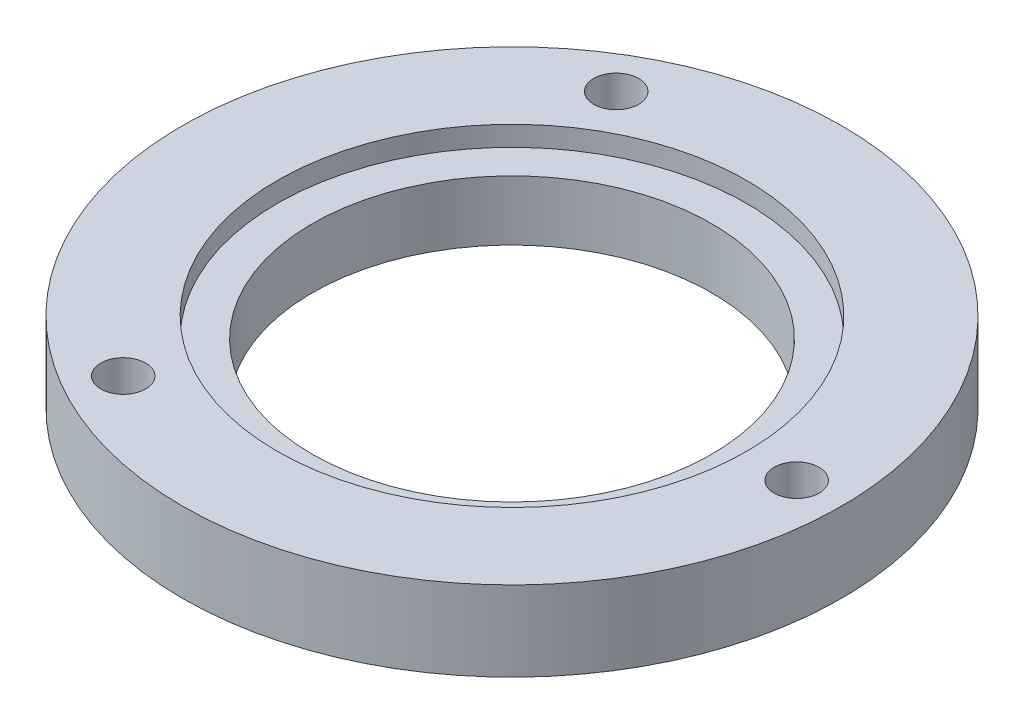
ISO-10303-21;
HEADER;
FILE_DESCRIPTION(('STEP AP214'),'2;1');
FILE_NAME('part.step','',(''),(''),'','','');
FILE_SCHEMA(('AUTOMOTIVE_DESIGN { 1 0 10303 214 1 1 1 1 }'));
ENDSEC;
DATA;
#1=APPLICATION_CONTEXT('core data for automotive mechanical design processes');
#2=APPLICATION_PROTOCOL_DEFINITION('international standard','automotive_design',2000,#1);
#3=PRODUCT_CONTEXT('',#1,'mechanical');
#4=PRODUCT('Part','Part','',(#3));
#5=PRODUCT_RELATED_PRODUCT_CATEGORY('part','',(#4));
#6=PRODUCT_DEFINITION_FORMATION('','',#4);
#7=PRODUCT_DEFINITION_CONTEXT('part definition',#1,'design');
#8=PRODUCT_DEFINITION('design','',#6,#7);
#9=PRODUCT_DEFINITION_SHAPE('','',#8);
#10=(LENGTH_UNIT() NAMED_UNIT(*) SI_UNIT(.MILLI.,.METRE.));
#11=(NAMED_UNIT(*) PLANE_ANGLE_UNIT() SI_UNIT($,.RADIAN.));
#12=(NAMED_UNIT(*) SI_UNIT($,.STERADIAN.) SOLID_ANGLE_UNIT());
#13=UNCERTAINTY_MEASURE_WITH_UNIT(LENGTH_MEASURE(1.E-05),#10,'distance_accuracy_value','');
#14=(GEOMETRIC_REPRESENTATION_CONTEXT(3) GLOBAL_UNCERTAINTY_ASSIGNED_CONTEXT((#13)) GLOBAL_UNIT_ASSIGNED_CONTEXT((#10,
#11,#12)) REPRESENTATION_CONTEXT('',''));
#15=CARTESIAN_POINT('',(0.,0.,0.));
#16=DIRECTION('',(0.,0.,1.));
#17=DIRECTION('',(1.,0.,0.));
#18=AXIS2_PLACEMENT_3D('',#15,#16,#17);
#19=CARTESIAN_POINT('',(23.5,6.,0.));
#20=DIRECTION('',(0.,-1.,0.));
#21=DIRECTION('',(0.,0.,-1.));
#22=AXIS2_PLACEMENT_3D('',#19,#20,#21);
#23=PLANE('',#22);
#24=CARTESIAN_POINT('',(0.,6.,0.));
#25=DIRECTION('',(0.,1.,0.));
#26=DIRECTION('',(0.,0.,1.));
#27=AXIS2_PLACEMENT_3D('',#24,#25,#26);
#28=CIRCLE('',#27,20.);
#29=CARTESIAN_POINT('',(0.,6.,20.));
#30=VERTEX_POINT('',#29);
#31=EDGE_CURVE('E54',#30,#30,#28,.T.);
#32=ORIENTED_EDGE('',*,*,#31,.F.);
#33=EDGE_LOOP('',(#32));
#34=FACE_BOUND('',#33,.T.);
#35=CARTESIAN_POINT('',(0.,6.,0.));
#36=DIRECTION('',(0.,1.,0.));
#37=DIRECTION('',(0.,0.,1.));
#38=AXIS2_PLACEMENT_3D('',#35,#36,#37);
#39=CIRCLE('',#38,23.5);
#40=CARTESIAN_POINT('',(0.,6.,23.5));
#41=VERTEX_POINT('',#40);
#42=EDGE_CURVE('E10',#41,#41,#39,.T.);
#43=ORIENTED_EDGE('',*,*,#42,.T.);
#44=EDGE_LOOP('',(#43));
#45=FACE_BOUND('',#44,.T.);
#46=ADVANCED_FACE('F32',(#34,#45),#23,.F.);
#47=CARTESIAN_POINT('',(0.,31.1775459098498,0.));
#48=DIRECTION('',(0.,1.,0.));
#49=DIRECTION('',(0.,0.,1.));
#50=AXIS2_PLACEMENT_3D('',#47,#48,#49);
#51=CYLINDRICAL_SURFACE('',#50,23.5);
#52=ORIENTED_EDGE('',*,*,#42,.F.);
#53=EDGE_LOOP('',(#52));
#54=FACE_BOUND('',#53,.T.);
#55=CARTESIAN_POINT('',(0.,8.00000000000001,0.));
#56=DIRECTION('',(0.,1.,0.));
#57=DIRECTION('',(0.,0.,1.));
#58=AXIS2_PLACEMENT_3D('',#55,#56,#57);
#59=CIRCLE('',#58,23.5);
#60=CARTESIAN_POINT('',(0.,8.00000000000001,23.5));
#61=VERTEX_POINT('',#60);
#62=EDGE_CURVE('E38',#61,#61,#59,.T.);
#63=ORIENTED_EDGE('',*,*,#62,.T.);
#64=EDGE_LOOP('',(#63));
#65=FACE_BOUND('',#64,.T.);
#66=ADVANCED_FACE('F137',(#54,#65),#51,.F.);
#67=CARTESIAN_POINT('',(33.,8.,0.));
#68=DIRECTION('',(0.,-1.,0.));
#69=DIRECTION('',(0.,0.,-1.));
#70=AXIS2_PLACEMENT_3D('',#67,#68,#69);
#71=PLANE('',#70);
#72=CARTESIAN_POINT('',(-14.2499999999998,8.00000000000001,-24.6817240078566));
#73=DIRECTION('',(0.,-1.,0.));
#74=DIRECTION('',(0.,0.,-1.));
#75=AXIS2_PLACEMENT_3D('',#72,#73,#74);
#76=CIRCLE('',#75,2.25);
#77=CARTESIAN_POINT('',(-14.2499999999998,8.00000000000001,-26.9317240078566));
#78=VERTEX_POINT('',#77);
#79=EDGE_CURVE('E90',#78,#78,#76,.T.);
#80=ORIENTED_EDGE('',*,*,#79,.T.);
#81=EDGE_LOOP('',(#80));
#82=FACE_BOUND('',#81,.T.);
#83=CARTESIAN_POINT('',(-14.2500000000001,8.00000000000001,24.6817240078564));
#84=DIRECTION('',(0.,-1.,0.));
#85=DIRECTION('',(0.,0.,-1.));
#86=AXIS2_PLACEMENT_3D('',#83,#84,#85);
#87=CIRCLE('',#86,2.25);
#88=CARTESIAN_POINT('',(-14.2500000000001,8.00000000000001,22.4317240078564));
#89=VERTEX_POINT('',#88);
#90=EDGE_CURVE('E78',#89,#89,#87,.T.);
#91=ORIENTED_EDGE('',*,*,#90,.T.);
#92=EDGE_LOOP('',(#91));
#93=FACE_BOUND('',#92,.T.);
#94=CARTESIAN_POINT('',(28.5,8.00000000000001,0.));
#95=DIRECTION('',(0.,-1.,0.));
#96=DIRECTION('',(0.,0.,-1.));
#97=AXIS2_PLACEMENT_3D('',#94,#95,#96);
#98=CIRCLE('',#97,2.25);
#99=CARTESIAN_POINT('',(28.5,8.00000000000001,-2.25));
#100=VERTEX_POINT('',#99);
#101=EDGE_CURVE('E66',#100,#100,#98,.T.);
#102=ORIENTED_EDGE('',*,*,#101,.T.);
#103=EDGE_LOOP('',(#102));
#104=FACE_BOUND('',#103,.T.);
#105=ORIENTED_EDGE('',*,*,#62,.F.);
#106=EDGE_LOOP('',(#105));
#107=FACE_BOUND('',#106,.T.);
#108=CARTESIAN_POINT('',(0.,8.,0.));
#109=DIRECTION('',(0.,1.,0.));
#110=DIRECTION('',(0.,0.,1.));
#111=AXIS2_PLACEMENT_3D('',#108,#109,#110);
#112=CIRCLE('',#111,33.);
#113=CARTESIAN_POINT('',(0.,8.,33.));
#114=VERTEX_POINT('',#113);
#115=EDGE_CURVE('E42',#114,#114,#112,.T.);
#116=ORIENTED_EDGE('',*,*,#115,.T.);
#117=EDGE_LOOP('',(#116));
#118=FACE_BOUND('',#117,.T.);
#119=ADVANCED_FACE('F94',(#82,#93,#104,#107,#118),#71,.F.);
#120=CARTESIAN_POINT('',(0.,31.1775459098498,0.));
#121=DIRECTION('',(0.,1.,0.));
#122=DIRECTION('',(0.,0.,1.));
#123=AXIS2_PLACEMENT_3D('',#120,#121,#122);
#124=CYLINDRICAL_SURFACE('',#123,33.);
#125=ORIENTED_EDGE('',*,*,#115,.F.);
#126=EDGE_LOOP('',(#125));
#127=FACE_BOUND('',#126,.T.);
#128=CARTESIAN_POINT('',(0.,0.,0.));
#129=DIRECTION('',(0.,1.,0.));
#130=DIRECTION('',(0.,0.,1.));
#131=AXIS2_PLACEMENT_3D('',#128,#129,#130);
#132=CIRCLE('',#131,33.);
#133=CARTESIAN_POINT('',(0.,0.,33.));
#134=VERTEX_POINT('',#133);
#135=EDGE_CURVE('E46',#134,#134,#132,.T.);
#136=ORIENTED_EDGE('',*,*,#135,.T.);
#137=EDGE_LOOP('',(#136));
#138=FACE_BOUND('',#137,.T.);
#139=ADVANCED_FACE('F120',(#127,#138),#124,.T.);
#140=CARTESIAN_POINT('',(20.,0.,0.));
#141=DIRECTION('',(0.,1.,0.));
#142=DIRECTION('',(0.,0.,1.));
#143=AXIS2_PLACEMENT_3D('',#140,#141,#142);
#144=PLANE('',#143);
#145=CARTESIAN_POINT('',(-14.2499999999998,0.,-24.6817240078566));
#146=DIRECTION('',(0.,-1.,0.));
#147=DIRECTION('',(0.,0.,-1.));
#148=AXIS2_PLACEMENT_3D('',#145,#146,#147);
#149=CIRCLE('',#148,4.);
#150=CARTESIAN_POINT('',(-14.2499999999998,0.,-28.6817240078566));
#151=VERTEX_POINT('',#150);
#152=EDGE_CURVE('E81',#151,#151,#149,.T.);
#153=ORIENTED_EDGE('',*,*,#152,.F.);
#154=EDGE_LOOP('',(#153));
#155=FACE_BOUND('',#154,.T.);
#156=CARTESIAN_POINT('',(-14.2500000000001,0.,24.6817240078564));
#157=DIRECTION('',(0.,-1.,0.));
#158=DIRECTION('',(0.,0.,-1.));
#159=AXIS2_PLACEMENT_3D('',#156,#157,#158);
#160=CIRCLE('',#159,4.);
#161=CARTESIAN_POINT('',(-14.2500000000001,0.,20.6817240078564));
#162=VERTEX_POINT('',#161);
#163=EDGE_CURVE('E69',#162,#162,#160,.T.);
#164=ORIENTED_EDGE('',*,*,#163,.F.);
#165=EDGE_LOOP('',(#164));
#166=FACE_BOUND('',#165,.T.);
#167=CARTESIAN_POINT('',(28.5,0.,0.));
#168=DIRECTION('',(0.,-1.,0.));
#169=DIRECTION('',(0.,0.,-1.));
#170=AXIS2_PLACEMENT_3D('',#167,#168,#169);
#171=CIRCLE('',#170,4.);
#172=CARTESIAN_POINT('',(28.5,0.,-4.));
#173=VERTEX_POINT('',#172);
#174=EDGE_CURVE('E57',#173,#173,#171,.T.);
#175=ORIENTED_EDGE('',*,*,#174,.F.);
#176=EDGE_LOOP('',(#175));
#177=FACE_BOUND('',#176,.T.);
#178=ORIENTED_EDGE('',*,*,#135,.F.);
#179=EDGE_LOOP('',(#178));
#180=FACE_BOUND('',#179,.T.);
#181=CARTESIAN_POINT('',(0.,0.,0.));
#182=DIRECTION('',(0.,1.,0.));
#183=DIRECTION('',(0.,0.,1.));
#184=AXIS2_PLACEMENT_3D('',#181,#182,#183);
#185=CIRCLE('',#184,20.);
#186=CARTESIAN_POINT('',(0.,0.,20.));
#187=VERTEX_POINT('',#186);
#188=EDGE_CURVE('E51',#187,#187,#185,.T.);
#189=ORIENTED_EDGE('',*,*,#188,.T.);
#190=EDGE_LOOP('',(#189));
#191=FACE_BOUND('',#190,.T.);
#192=ADVANCED_FACE('F116',(#155,#166,#177,#180,#191),#144,.F.);
#193=CARTESIAN_POINT('',(0.,31.1775459098498,0.));
#194=DIRECTION('',(0.,1.,0.));
#195=DIRECTION('',(0.,0.,1.));
#196=AXIS2_PLACEMENT_3D('',#193,#194,#195);
#197=CYLINDRICAL_SURFACE('',#196,20.);
#198=ORIENTED_EDGE('',*,*,#188,.F.);
#199=EDGE_LOOP('',(#198));
#200=FACE_BOUND('',#199,.T.);
#201=ORIENTED_EDGE('',*,*,#31,.T.);
#202=EDGE_LOOP('',(#201));
#203=FACE_BOUND('',#202,.T.);
#204=ADVANCED_FACE('F119',(#200,#203),#197,.F.);
#205=CARTESIAN_POINT('',(28.5,0.,0.));
#206=DIRECTION('',(0.,-1.,0.));
#207=DIRECTION('',(0.,0.,-1.));
#208=AXIS2_PLACEMENT_3D('',#205,#206,#207);
#209=CYLINDRICAL_SURFACE('',#208,4.);
#210=CARTESIAN_POINT('',(28.5,4.,0.));
#211=DIRECTION('',(0.,-1.,0.));
#212=DIRECTION('',(0.,0.,-1.));
#213=AXIS2_PLACEMENT_3D('',#210,#211,#212);
#214=CIRCLE('',#213,4.);
#215=CARTESIAN_POINT('',(28.5,4.,-4.));
#216=VERTEX_POINT('',#215);
#217=EDGE_CURVE('E60',#216,#216,#214,.T.);
#218=ORIENTED_EDGE('',*,*,#217,.F.);
#219=EDGE_LOOP('',(#218));
#220=FACE_BOUND('',#219,.T.);
#221=ORIENTED_EDGE('',*,*,#174,.T.);
#222=EDGE_LOOP('',(#221));
#223=FACE_BOUND('',#222,.T.);
#224=ADVANCED_FACE('F132',(#220,#223),#209,.F.);
#225=CARTESIAN_POINT('',(30.75,4.,0.));
#226=DIRECTION('',(0.,1.,0.));
#227=DIRECTION('',(0.,0.,1.));
#228=AXIS2_PLACEMENT_3D('',#225,#226,#227);
#229=PLANE('',#228);
#230=CARTESIAN_POINT('',(28.5,4.,0.));
#231=DIRECTION('',(0.,-1.,0.));
#232=DIRECTION('',(0.,0.,-1.));
#233=AXIS2_PLACEMENT_3D('',#230,#231,#232);
#234=CIRCLE('',#233,2.25);
#235=CARTESIAN_POINT('',(28.5,4.,-2.25));
#236=VERTEX_POINT('',#235);
#237=EDGE_CURVE('E63',#236,#236,#234,.T.);
#238=ORIENTED_EDGE('',*,*,#237,.F.);
#239=EDGE_LOOP('',(#238));
#240=FACE_BOUND('',#239,.T.);
#241=ORIENTED_EDGE('',*,*,#217,.T.);
#242=EDGE_LOOP('',(#241));
#243=FACE_BOUND('',#242,.T.);
#244=ADVANCED_FACE('F152',(#240,#243),#229,.F.);
#245=CARTESIAN_POINT('',(28.5,0.,0.));
#246=DIRECTION('',(0.,-1.,0.));
#247=DIRECTION('',(0.,0.,-1.));
#248=AXIS2_PLACEMENT_3D('',#245,#246,#247);
#249=CYLINDRICAL_SURFACE('',#248,2.25);
#250=ORIENTED_EDGE('',*,*,#101,.F.);
#251=EDGE_LOOP('',(#250));
#252=FACE_BOUND('',#251,.T.);
#253=ORIENTED_EDGE('',*,*,#237,.T.);
#254=EDGE_LOOP('',(#253));
#255=FACE_BOUND('',#254,.T.);
#256=ADVANCED_FACE('F156',(#252,#255),#249,.F.);
#257=CARTESIAN_POINT('',(-14.2500000000001,0.,24.6817240078564));
#258=DIRECTION('',(0.,-1.,0.));
#259=DIRECTION('',(0.,0.,-1.));
#260=AXIS2_PLACEMENT_3D('',#257,#258,#259);
#261=CYLINDRICAL_SURFACE('',#260,4.);
#262=CARTESIAN_POINT('',(-14.2500000000001,4.,24.6817240078564));
#263=DIRECTION('',(0.,-1.,0.));
#264=DIRECTION('',(0.,0.,-1.));
#265=AXIS2_PLACEMENT_3D('',#262,#263,#264);
#266=CIRCLE('',#265,4.);
#267=CARTESIAN_POINT('',(-14.2500000000001,4.,20.6817240078564));
#268=VERTEX_POINT('',#267);
#269=EDGE_CURVE('E72',#268,#268,#266,.T.);
#270=ORIENTED_EDGE('',*,*,#269,.F.);
#271=EDGE_LOOP('',(#270));
#272=FACE_BOUND('',#271,.T.);
#273=ORIENTED_EDGE('',*,*,#163,.T.);
#274=EDGE_LOOP('',(#273));
#275=FACE_BOUND('',#274,.T.);
#276=ADVANCED_FACE('F160',(#272,#275),#261,.F.);
#277=CARTESIAN_POINT('',(-12.0000000000001,4.,24.6817240078564));
#278=DIRECTION('',(0.,1.,0.));
#279=DIRECTION('',(0.,0.,1.));
#280=AXIS2_PLACEMENT_3D('',#277,#278,#279);
#281=PLANE('',#280);
#282=CARTESIAN_POINT('',(-14.2500000000001,4.,24.6817240078564));
#283=DIRECTION('',(0.,-1.,0.));
#284=DIRECTION('',(0.,0.,-1.));
#285=AXIS2_PLACEMENT_3D('',#282,#283,#284);
#286=CIRCLE('',#285,2.25);
#287=CARTESIAN_POINT('',(-14.2500000000001,4.,22.4317240078564));
#288=VERTEX_POINT('',#287);
#289=EDGE_CURVE('E75',#288,#288,#286,.T.);
#290=ORIENTED_EDGE('',*,*,#289,.F.);
#291=EDGE_LOOP('',(#290));
#292=FACE_BOUND('',#291,.T.);
#293=ORIENTED_EDGE('',*,*,#269,.T.);
#294=EDGE_LOOP('',(#293));
#295=FACE_BOUND('',#294,.T.);
#296=ADVANCED_FACE('F164',(#292,#295),#281,.F.);
#297=CARTESIAN_POINT('',(-14.2500000000001,0.,24.6817240078564));
#298=DIRECTION('',(0.,-1.,0.));
#299=DIRECTION('',(0.,0.,-1.));
#300=AXIS2_PLACEMENT_3D('',#297,#298,#299);
#301=CYLINDRICAL_SURFACE('',#300,2.25);
#302=ORIENTED_EDGE('',*,*,#90,.F.);
#303=EDGE_LOOP('',(#302));
#304=FACE_BOUND('',#303,.T.);
#305=ORIENTED_EDGE('',*,*,#289,.T.);
#306=EDGE_LOOP('',(#305));
#307=FACE_BOUND('',#306,.T.);
#308=ADVANCED_FACE('F112',(#304,#307),#301,.F.);
#309=CARTESIAN_POINT('',(-14.2499999999998,0.,-24.6817240078566));
#310=DIRECTION('',(0.,-1.,0.));
#311=DIRECTION('',(0.,0.,-1.));
#312=AXIS2_PLACEMENT_3D('',#309,#310,#311);
#313=CYLINDRICAL_SURFACE('',#312,4.);
#314=CARTESIAN_POINT('',(-14.2499999999998,4.,-24.6817240078566));
#315=DIRECTION('',(0.,-1.,0.));
#316=DIRECTION('',(0.,0.,-1.));
#317=AXIS2_PLACEMENT_3D('',#314,#315,#316);
#318=CIRCLE('',#317,4.);
#319=CARTESIAN_POINT('',(-14.2499999999998,4.,-28.6817240078566));
#320=VERTEX_POINT('',#319);
#321=EDGE_CURVE('E84',#320,#320,#318,.T.);
#322=ORIENTED_EDGE('',*,*,#321,.F.);
#323=EDGE_LOOP('',(#322));
#324=FACE_BOUND('',#323,.T.);
#325=ORIENTED_EDGE('',*,*,#152,.T.);
#326=EDGE_LOOP('',(#325));
#327=FACE_BOUND('',#326,.T.);
#328=ADVANCED_FACE('F106',(#324,#327),#313,.F.);
#329=CARTESIAN_POINT('',(-11.9999999999998,4.,-24.6817240078566));
#330=DIRECTION('',(0.,1.,0.));
#331=DIRECTION('',(0.,0.,1.));
#332=AXIS2_PLACEMENT_3D('',#329,#330,#331);
#333=PLANE('',#332);
#334=CARTESIAN_POINT('',(-14.2499999999998,4.,-24.6817240078566));
#335=DIRECTION('',(0.,-1.,0.));
#336=DIRECTION('',(0.,0.,-1.));
#337=AXIS2_PLACEMENT_3D('',#334,#335,#336);
#338=CIRCLE('',#337,2.25);
#339=CARTESIAN_POINT('',(-14.2499999999998,4.,-26.9317240078566));
#340=VERTEX_POINT('',#339);
#341=EDGE_CURVE('E87',#340,#340,#338,.T.);
#342=ORIENTED_EDGE('',*,*,#341,.F.);
#343=EDGE_LOOP('',(#342));
#344=FACE_BOUND('',#343,.T.);
#345=ORIENTED_EDGE('',*,*,#321,.T.);
#346=EDGE_LOOP('',(#345));
#347=FACE_BOUND('',#346,.T.);
#348=ADVANCED_FACE('F100',(#344,#347),#333,.F.);
#349=CARTESIAN_POINT('',(-14.2499999999998,0.,-24.6817240078566));
#350=DIRECTION('',(0.,-1.,0.));
#351=DIRECTION('',(0.,0.,-1.));
#352=AXIS2_PLACEMENT_3D('',#349,#350,#351);
#353=CYLINDRICAL_SURFACE('',#352,2.25);
#354=ORIENTED_EDGE('',*,*,#79,.F.);
#355=EDGE_LOOP('',(#354));
#356=FACE_BOUND('',#355,.T.);
#357=ORIENTED_EDGE('',*,*,#341,.T.);
#358=EDGE_LOOP('',(#357));
#359=FACE_BOUND('',#358,.T.);
#360=ADVANCED_FACE('F97',(#356,#359),#353,.F.);
#361=CLOSED_SHELL('',(#46,#66,#119,#139,#192,#204,#224,#244,#256,#276,#296,#308,#328,#348,#360));
#362=MANIFOLD_SOLID_BREP('B2',#361);
#363=ADVANCED_BREP_SHAPE_REPRESENTATION('',(#18,#362),#14);
#364=SHAPE_DEFINITION_REPRESENTATION(#9,#363);
ENDSEC;
END-ISO-10303-21;
